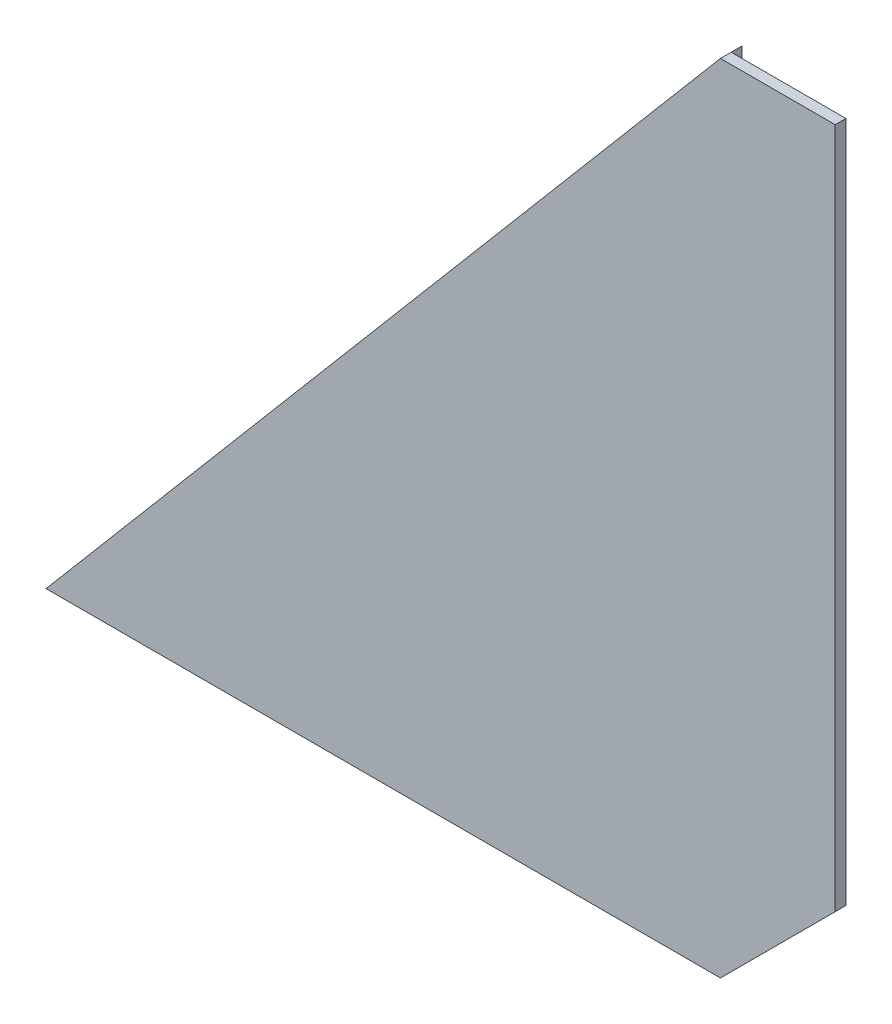
ISO-10303-21;
HEADER;
FILE_DESCRIPTION(('STEP AP214'),'2;1');
FILE_NAME('part.step','',(''),(''),'','','');
FILE_SCHEMA(('AUTOMOTIVE_DESIGN { 1 0 10303 214 1 1 1 1 }'));
ENDSEC;
DATA;
#1=APPLICATION_CONTEXT('core data for automotive mechanical design processes');
#2=APPLICATION_PROTOCOL_DEFINITION('international standard','automotive_design',2000,#1);
#3=PRODUCT_CONTEXT('',#1,'mechanical');
#4=PRODUCT('Part','Part','',(#3));
#5=PRODUCT_RELATED_PRODUCT_CATEGORY('part','',(#4));
#6=PRODUCT_DEFINITION_FORMATION('','',#4);
#7=PRODUCT_DEFINITION_CONTEXT('part definition',#1,'design');
#8=PRODUCT_DEFINITION('design','',#6,#7);
#9=PRODUCT_DEFINITION_SHAPE('','',#8);
#10=(LENGTH_UNIT() NAMED_UNIT(*) SI_UNIT(.MILLI.,.METRE.));
#11=(NAMED_UNIT(*) PLANE_ANGLE_UNIT() SI_UNIT($,.RADIAN.));
#12=(NAMED_UNIT(*) SI_UNIT($,.STERADIAN.) SOLID_ANGLE_UNIT());
#13=UNCERTAINTY_MEASURE_WITH_UNIT(LENGTH_MEASURE(1.E-05),#10,'distance_accuracy_value','');
#14=(GEOMETRIC_REPRESENTATION_CONTEXT(3) GLOBAL_UNCERTAINTY_ASSIGNED_CONTEXT((#13)) GLOBAL_UNIT_ASSIGNED_CONTEXT((#10,
#11,#12)) REPRESENTATION_CONTEXT('',''));
#15=CARTESIAN_POINT('',(0.,0.,0.));
#16=DIRECTION('',(0.,0.,1.));
#17=DIRECTION('',(1.,0.,0.));
#18=AXIS2_PLACEMENT_3D('',#15,#16,#17);
#19=CARTESIAN_POINT('',(-98.2063951167096,0.,-1.5));
#20=DIRECTION('',(0.,1.,0.));
#21=DIRECTION('',(0.,0.,-1.));
#22=AXIS2_PLACEMENT_3D('',#19,#20,#21);
#23=PLANE('',#22);
#24=DIRECTION('',(1.,0.,0.));
#25=VECTOR('',#24,1.);
#26=CARTESIAN_POINT('',(-98.2063951167096,0.,0.));
#27=LINE('',#26,#25);
#28=CARTESIAN_POINT('',(-110.,0.,0.));
#29=VERTEX_POINT('',#28);
#30=CARTESIAN_POINT('',(-16.,0.,0.));
#31=VERTEX_POINT('',#30);
#32=EDGE_CURVE('E123',#29,#31,#27,.T.);
#33=ORIENTED_EDGE('',*,*,#32,.F.);
#34=DIRECTION('',(0.,0.,1.));
#35=VECTOR('',#34,1.);
#36=CARTESIAN_POINT('',(-110.,0.,-3.));
#37=LINE('',#36,#35);
#38=CARTESIAN_POINT('',(-110.,0.,-3.));
#39=VERTEX_POINT('',#38);
#40=EDGE_CURVE('E127',#39,#29,#37,.T.);
#41=ORIENTED_EDGE('',*,*,#40,.F.);
#42=DIRECTION('',(1.,0.,0.));
#43=VECTOR('',#42,1.);
#44=CARTESIAN_POINT('',(-110.,0.,-3.));
#45=LINE('',#44,#43);
#46=CARTESIAN_POINT('',(-98.2063951167096,0.,-3.));
#47=VERTEX_POINT('',#46);
#48=EDGE_CURVE('E165',#39,#47,#45,.T.);
#49=ORIENTED_EDGE('',*,*,#48,.T.);
#50=DIRECTION('',(0.,0.,1.));
#51=VECTOR('',#50,1.);
#52=CARTESIAN_POINT('',(-98.2063951167096,0.,-3.));
#53=LINE('',#52,#51);
#54=CARTESIAN_POINT('',(-98.2063951167096,0.,-1.5));
#55=VERTEX_POINT('',#54);
#56=EDGE_CURVE('E161',#47,#55,#53,.T.);
#57=ORIENTED_EDGE('',*,*,#56,.T.);
#58=DIRECTION('',(1.,0.,0.));
#59=VECTOR('',#58,1.);
#60=CARTESIAN_POINT('',(-98.2063951167096,0.,-1.5));
#61=LINE('',#60,#59);
#62=CARTESIAN_POINT('',(-16.,0.,-1.5));
#63=VERTEX_POINT('',#62);
#64=EDGE_CURVE('E133',#55,#63,#61,.T.);
#65=ORIENTED_EDGE('',*,*,#64,.T.);
#66=DIRECTION('',(0.,0.,1.));
#67=VECTOR('',#66,1.);
#68=CARTESIAN_POINT('',(-16.,0.,-1.5));
#69=LINE('',#68,#67);
#70=EDGE_CURVE('E11',#63,#31,#69,.T.);
#71=ORIENTED_EDGE('',*,*,#70,.T.);
#72=EDGE_LOOP('',(#33,#41,#49,#57,#65,#71));
#73=FACE_BOUND('',#72,.T.);
#74=ADVANCED_FACE('F33',(#73),#23,.F.);
#75=CARTESIAN_POINT('',(-16.,0.,-1.5));
#76=DIRECTION('',(-0.707106781186547,0.707106781186547,0.));
#77=DIRECTION('',(-0.707106781186548,-0.707106781186548,0.));
#78=AXIS2_PLACEMENT_3D('',#75,#76,#77);
#79=PLANE('',#78);
#80=DIRECTION('',(0.707106781186548,0.707106781186548,0.));
#81=VECTOR('',#80,1.);
#82=CARTESIAN_POINT('',(-16.,0.,0.));
#83=LINE('',#82,#81);
#84=CARTESIAN_POINT('',(0.,16.,0.));
#85=VERTEX_POINT('',#84);
#86=EDGE_CURVE('E126',#31,#85,#83,.T.);
#87=ORIENTED_EDGE('',*,*,#86,.F.);
#88=ORIENTED_EDGE('',*,*,#70,.F.);
#89=DIRECTION('',(0.707106781186548,0.707106781186548,0.));
#90=VECTOR('',#89,1.);
#91=CARTESIAN_POINT('',(-16.,0.,-1.5));
#92=LINE('',#91,#90);
#93=CARTESIAN_POINT('',(0.,16.,-1.5));
#94=VERTEX_POINT('',#93);
#95=EDGE_CURVE('E82',#63,#94,#92,.T.);
#96=ORIENTED_EDGE('',*,*,#95,.T.);
#97=DIRECTION('',(0.,0.,1.));
#98=VECTOR('',#97,1.);
#99=CARTESIAN_POINT('',(0.,16.,-1.5));
#100=LINE('',#99,#98);
#101=EDGE_CURVE('E41',#94,#85,#100,.T.);
#102=ORIENTED_EDGE('',*,*,#101,.T.);
#103=EDGE_LOOP('',(#87,#88,#96,#102));
#104=FACE_BOUND('',#103,.T.);
#105=ADVANCED_FACE('F138',(#104),#79,.F.);
#106=CARTESIAN_POINT('',(0.,16.,-1.5));
#107=DIRECTION('',(-1.,0.,0.));
#108=DIRECTION('',(0.,0.,-1.));
#109=AXIS2_PLACEMENT_3D('',#106,#107,#108);
#110=PLANE('',#109);
#111=DIRECTION('',(0.,1.,0.));
#112=VECTOR('',#111,1.);
#113=CARTESIAN_POINT('',(0.,16.,0.));
#114=LINE('',#113,#112);
#115=CARTESIAN_POINT('',(0.,111.,0.));
#116=VERTEX_POINT('',#115);
#117=EDGE_CURVE('E130',#85,#116,#114,.T.);
#118=ORIENTED_EDGE('',*,*,#117,.F.);
#119=ORIENTED_EDGE('',*,*,#101,.F.);
#120=DIRECTION('',(0.,1.,0.));
#121=VECTOR('',#120,1.);
#122=CARTESIAN_POINT('',(0.,16.,-1.5));
#123=LINE('',#122,#121);
#124=CARTESIAN_POINT('',(0.,111.,-1.5));
#125=VERTEX_POINT('',#124);
#126=EDGE_CURVE('E117',#94,#125,#123,.T.);
#127=ORIENTED_EDGE('',*,*,#126,.T.);
#128=DIRECTION('',(0.,0.,1.));
#129=VECTOR('',#128,1.);
#130=CARTESIAN_POINT('',(0.,111.,-1.5));
#131=LINE('',#130,#129);
#132=EDGE_CURVE('E113',#125,#116,#131,.T.);
#133=ORIENTED_EDGE('',*,*,#132,.T.);
#134=EDGE_LOOP('',(#118,#119,#127,#133));
#135=FACE_BOUND('',#134,.T.);
#136=ADVANCED_FACE('F185',(#135),#110,.F.);
#137=CARTESIAN_POINT('',(0.,111.,-1.5));
#138=DIRECTION('',(0.,-1.,0.));
#139=DIRECTION('',(0.,0.,1.));
#140=AXIS2_PLACEMENT_3D('',#137,#138,#139);
#141=PLANE('',#140);
#142=DIRECTION('',(-1.,0.,0.));
#143=VECTOR('',#142,1.);
#144=CARTESIAN_POINT('',(0.,111.,0.));
#145=LINE('',#144,#143);
#146=CARTESIAN_POINT('',(-16.,111.,0.));
#147=VERTEX_POINT('',#146);
#148=EDGE_CURVE('E67',#116,#147,#145,.T.);
#149=ORIENTED_EDGE('',*,*,#148,.F.);
#150=ORIENTED_EDGE('',*,*,#132,.F.);
#151=DIRECTION('',(-1.,0.,0.));
#152=VECTOR('',#151,1.);
#153=CARTESIAN_POINT('',(0.,111.,-1.5));
#154=LINE('',#153,#152);
#155=CARTESIAN_POINT('',(-16.,111.,-1.5));
#156=VERTEX_POINT('',#155);
#157=EDGE_CURVE('E109',#125,#156,#154,.T.);
#158=ORIENTED_EDGE('',*,*,#157,.T.);
#159=DIRECTION('',(0.,0.,1.));
#160=VECTOR('',#159,1.);
#161=CARTESIAN_POINT('',(-16.,111.,-1.5));
#162=LINE('',#161,#160);
#163=EDGE_CURVE('E111',#156,#147,#162,.T.);
#164=ORIENTED_EDGE('',*,*,#163,.T.);
#165=EDGE_LOOP('',(#149,#150,#158,#164));
#166=FACE_BOUND('',#165,.T.);
#167=ADVANCED_FACE('F115',(#166),#141,.F.);
#168=CARTESIAN_POINT('',(0.,0.,-1.5));
#169=DIRECTION('',(0.,0.,-1.));
#170=DIRECTION('',(1.,0.,0.));
#171=AXIS2_PLACEMENT_3D('',#168,#169,#170);
#172=PLANE('',#171);
#173=ORIENTED_EDGE('',*,*,#64,.F.);
#174=DIRECTION('',(-0.646250378662442,-0.763125447143948,0.));
#175=VECTOR('',#174,1.);
#176=CARTESIAN_POINT('',(-16.,97.0735091271785,-1.5));
#177=LINE('',#176,#175);
#178=CARTESIAN_POINT('',(-16.,97.0735091271785,-1.5));
#179=VERTEX_POINT('',#178);
#180=EDGE_CURVE('E49',#179,#55,#177,.T.);
#181=ORIENTED_EDGE('',*,*,#180,.F.);
#182=DIRECTION('',(0.,-1.,0.));
#183=VECTOR('',#182,1.);
#184=CARTESIAN_POINT('',(-16.,111.,-1.5));
#185=LINE('',#184,#183);
#186=EDGE_CURVE('E100',#156,#179,#185,.T.);
#187=ORIENTED_EDGE('',*,*,#186,.F.);
#188=ORIENTED_EDGE('',*,*,#157,.F.);
#189=ORIENTED_EDGE('',*,*,#126,.F.);
#190=ORIENTED_EDGE('',*,*,#95,.F.);
#191=EDGE_LOOP('',(#173,#181,#187,#188,#189,#190));
#192=FACE_BOUND('',#191,.T.);
#193=ADVANCED_FACE('F107',(#192),#172,.T.);
#194=CARTESIAN_POINT('',(0.,0.,0.));
#195=DIRECTION('',(0.,0.,-1.));
#196=DIRECTION('',(1.,0.,0.));
#197=AXIS2_PLACEMENT_3D('',#194,#195,#196);
#198=PLANE('',#197);
#199=ORIENTED_EDGE('',*,*,#32,.T.);
#200=ORIENTED_EDGE('',*,*,#86,.T.);
#201=ORIENTED_EDGE('',*,*,#117,.T.);
#202=ORIENTED_EDGE('',*,*,#148,.T.);
#203=DIRECTION('',(-0.646250378662442,-0.763125447143948,0.));
#204=VECTOR('',#203,1.);
#205=CARTESIAN_POINT('',(-16.,111.,0.));
#206=LINE('',#205,#204);
#207=EDGE_CURVE('E75',#147,#29,#206,.T.);
#208=ORIENTED_EDGE('',*,*,#207,.T.);
#209=EDGE_LOOP('',(#199,#200,#201,#202,#208));
#210=FACE_BOUND('',#209,.T.);
#211=ADVANCED_FACE('F141',(#210),#198,.F.);
#212=CARTESIAN_POINT('',(-16.,111.,-3.));
#213=DIRECTION('',(0.763125447143948,-0.646250378662442,0.));
#214=DIRECTION('',(0.646250378662442,0.763125447143948,0.));
#215=AXIS2_PLACEMENT_3D('',#212,#213,#214);
#216=PLANE('',#215);
#217=ORIENTED_EDGE('',*,*,#207,.F.);
#218=ORIENTED_EDGE('',*,*,#163,.F.);
#219=DIRECTION('',(0.,0.,1.));
#220=VECTOR('',#219,1.);
#221=CARTESIAN_POINT('',(-16.,111.,-3.));
#222=LINE('',#221,#220);
#223=CARTESIAN_POINT('',(-16.,111.,-3.));
#224=VERTEX_POINT('',#223);
#225=EDGE_CURVE('E96',#224,#156,#222,.T.);
#226=ORIENTED_EDGE('',*,*,#225,.F.);
#227=DIRECTION('',(-0.646250378662442,-0.763125447143948,0.));
#228=VECTOR('',#227,1.);
#229=CARTESIAN_POINT('',(-16.,111.,-3.));
#230=LINE('',#229,#228);
#231=EDGE_CURVE('E150',#224,#39,#230,.T.);
#232=ORIENTED_EDGE('',*,*,#231,.T.);
#233=ORIENTED_EDGE('',*,*,#40,.T.);
#234=EDGE_LOOP('',(#217,#218,#226,#232,#233));
#235=FACE_BOUND('',#234,.T.);
#236=ADVANCED_FACE('F112',(#235),#216,.F.);
#237=CARTESIAN_POINT('',(-98.2063951167096,0.,-3.));
#238=DIRECTION('',(-0.763125447143948,0.646250378662442,0.));
#239=DIRECTION('',(-0.646250378662442,-0.763125447143948,0.));
#240=AXIS2_PLACEMENT_3D('',#237,#238,#239);
#241=PLANE('',#240);
#242=ORIENTED_EDGE('',*,*,#180,.T.);
#243=ORIENTED_EDGE('',*,*,#56,.F.);
#244=DIRECTION('',(0.646250378662442,0.763125447143948,0.));
#245=VECTOR('',#244,1.);
#246=CARTESIAN_POINT('',(-98.2063951167096,0.,-3.));
#247=LINE('',#246,#245);
#248=CARTESIAN_POINT('',(-16.,97.0735091271785,-3.));
#249=VERTEX_POINT('',#248);
#250=EDGE_CURVE('E159',#47,#249,#247,.T.);
#251=ORIENTED_EDGE('',*,*,#250,.T.);
#252=DIRECTION('',(0.,0.,1.));
#253=VECTOR('',#252,1.);
#254=CARTESIAN_POINT('',(-16.,97.0735091271785,-3.));
#255=LINE('',#254,#253);
#256=EDGE_CURVE('E105',#249,#179,#255,.T.);
#257=ORIENTED_EDGE('',*,*,#256,.T.);
#258=EDGE_LOOP('',(#242,#243,#251,#257));
#259=FACE_BOUND('',#258,.T.);
#260=ADVANCED_FACE('F163',(#259),#241,.F.);
#261=CARTESIAN_POINT('',(-16.,97.0735091271785,-3.));
#262=DIRECTION('',(-1.,0.,0.));
#263=DIRECTION('',(0.,-1.,0.));
#264=AXIS2_PLACEMENT_3D('',#261,#262,#263);
#265=PLANE('',#264);
#266=ORIENTED_EDGE('',*,*,#186,.T.);
#267=ORIENTED_EDGE('',*,*,#256,.F.);
#268=DIRECTION('',(0.,1.,0.));
#269=VECTOR('',#268,1.);
#270=CARTESIAN_POINT('',(-16.,97.0735091271785,-3.));
#271=LINE('',#270,#269);
#272=EDGE_CURVE('E102',#249,#224,#271,.T.);
#273=ORIENTED_EDGE('',*,*,#272,.T.);
#274=ORIENTED_EDGE('',*,*,#225,.T.);
#275=EDGE_LOOP('',(#266,#267,#273,#274));
#276=FACE_BOUND('',#275,.T.);
#277=ADVANCED_FACE('F98',(#276),#265,.F.);
#278=CARTESIAN_POINT('',(0.,0.,-3.));
#279=DIRECTION('',(0.,0.,-1.));
#280=DIRECTION('',(1.,0.,0.));
#281=AXIS2_PLACEMENT_3D('',#278,#279,#280);
#282=PLANE('',#281);
#283=ORIENTED_EDGE('',*,*,#231,.F.);
#284=ORIENTED_EDGE('',*,*,#272,.F.);
#285=ORIENTED_EDGE('',*,*,#250,.F.);
#286=ORIENTED_EDGE('',*,*,#48,.F.);
#287=EDGE_LOOP('',(#283,#284,#285,#286));
#288=FACE_BOUND('',#287,.T.);
#289=ADVANCED_FACE('F157',(#288),#282,.T.);
#290=CLOSED_SHELL('',(#74,#105,#136,#167,#193,#211,#236,#260,#277,#289));
#291=MANIFOLD_SOLID_BREP('B2',#290);
#292=ADVANCED_BREP_SHAPE_REPRESENTATION('',(#18,#291),#14);
#293=SHAPE_DEFINITION_REPRESENTATION(#9,#292);
ENDSEC;
END-ISO-10303-21;
